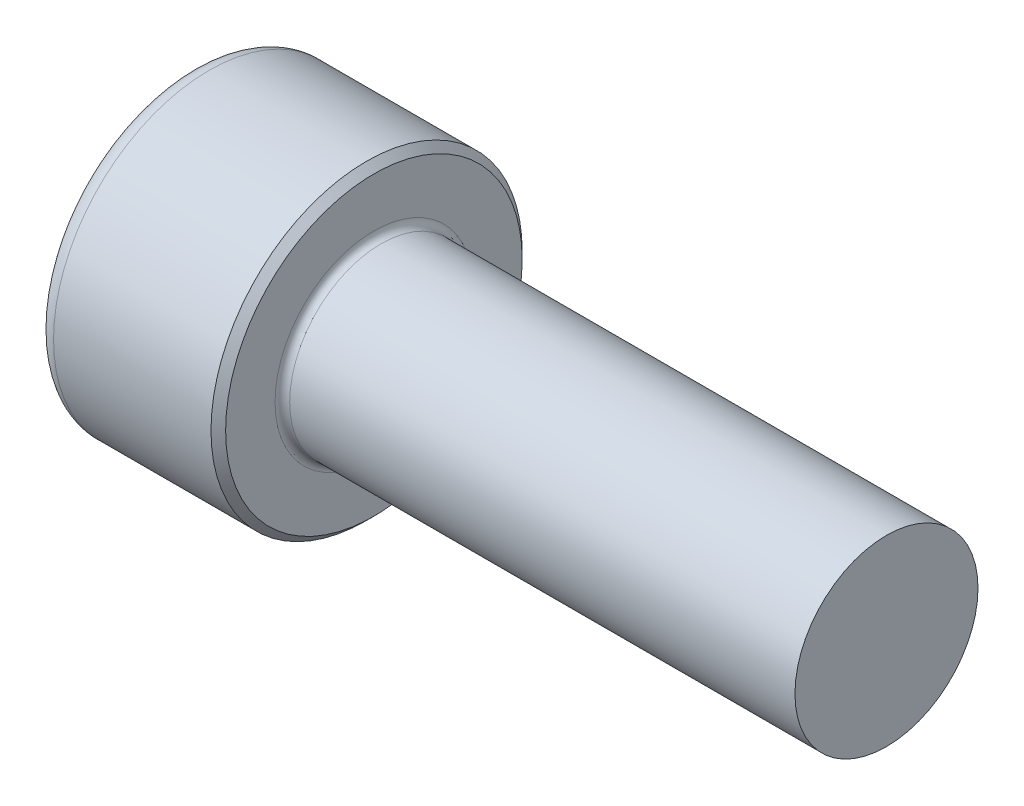
ISO-10303-21;
HEADER;
FILE_DESCRIPTION(('STEP AP214'),'2;1');
FILE_NAME('part.step','',(''),(''),'','','');
FILE_SCHEMA(('AUTOMOTIVE_DESIGN { 1 0 10303 214 1 1 1 1 }'));
ENDSEC;
DATA;
#1=APPLICATION_CONTEXT('core data for automotive mechanical design processes');
#2=APPLICATION_PROTOCOL_DEFINITION('international standard','automotive_design',2000,#1);
#3=PRODUCT_CONTEXT('',#1,'mechanical');
#4=PRODUCT('Part','Part','',(#3));
#5=PRODUCT_RELATED_PRODUCT_CATEGORY('part','',(#4));
#6=PRODUCT_DEFINITION_FORMATION('','',#4);
#7=PRODUCT_DEFINITION_CONTEXT('part definition',#1,'design');
#8=PRODUCT_DEFINITION('design','',#6,#7);
#9=PRODUCT_DEFINITION_SHAPE('','',#8);
#10=(LENGTH_UNIT() NAMED_UNIT(*) SI_UNIT(.MILLI.,.METRE.));
#11=(NAMED_UNIT(*) PLANE_ANGLE_UNIT() SI_UNIT($,.RADIAN.));
#12=(NAMED_UNIT(*) SI_UNIT($,.STERADIAN.) SOLID_ANGLE_UNIT());
#13=UNCERTAINTY_MEASURE_WITH_UNIT(LENGTH_MEASURE(1.E-05),#10,'distance_accuracy_value','');
#14=(GEOMETRIC_REPRESENTATION_CONTEXT(3) GLOBAL_UNCERTAINTY_ASSIGNED_CONTEXT((#13)) GLOBAL_UNIT_ASSIGNED_CONTEXT((#10,
#11,#12)) REPRESENTATION_CONTEXT('',''));
#15=CARTESIAN_POINT('',(0.,0.,0.));
#16=DIRECTION('',(0.,0.,1.));
#17=DIRECTION('',(1.,0.,0.));
#18=AXIS2_PLACEMENT_3D('',#15,#16,#17);
#19=CARTESIAN_POINT('',(0.,0.,0.));
#20=DIRECTION('',(-1.,0.,0.));
#21=DIRECTION('',(0.,0.,1.));
#22=AXIS2_PLACEMENT_3D('',#19,#20,#21);
#23=CYLINDRICAL_SURFACE('',#22,2.5);
#24=CARTESIAN_POINT('',(5.2,0.,0.));
#25=DIRECTION('',(-1.,0.,0.));
#26=DIRECTION('',(0.,0.,1.));
#27=AXIS2_PLACEMENT_3D('',#24,#25,#26);
#28=CIRCLE('',#27,2.5);
#29=CARTESIAN_POINT('',(5.2,0.,2.5));
#30=VERTEX_POINT('',#29);
#31=EDGE_CURVE('E201',#30,#30,#28,.T.);
#32=ORIENTED_EDGE('',*,*,#31,.F.);
#33=EDGE_LOOP('',(#32));
#34=FACE_BOUND('',#33,.T.);
#35=CARTESIAN_POINT('',(19.,0.,0.));
#36=DIRECTION('',(1.,0.,0.));
#37=DIRECTION('',(0.,0.,-1.));
#38=AXIS2_PLACEMENT_3D('',#35,#36,#37);
#39=CIRCLE('',#38,2.5);
#40=CARTESIAN_POINT('',(19.,0.,-2.5));
#41=VERTEX_POINT('',#40);
#42=EDGE_CURVE('E48',#41,#41,#39,.T.);
#43=ORIENTED_EDGE('',*,*,#42,.F.);
#44=EDGE_LOOP('',(#43));
#45=FACE_BOUND('',#44,.T.);
#46=ADVANCED_FACE('F44',(#34,#45),#23,.T.);
#47=CARTESIAN_POINT('',(0.,0.,0.));
#48=DIRECTION('',(1.,0.,0.));
#49=DIRECTION('',(0.,0.,-1.));
#50=AXIS2_PLACEMENT_3D('',#47,#48,#49);
#51=PLANE('',#50);
#52=CARTESIAN_POINT('',(0.,0.,0.));
#53=DIRECTION('',(1.,0.,0.));
#54=DIRECTION('',(0.,0.,-1.));
#55=AXIS2_PLACEMENT_3D('',#52,#53,#54);
#56=CIRCLE('',#55,3.75);
#57=CARTESIAN_POINT('',(0.,0.,-3.75));
#58=VERTEX_POINT('',#57);
#59=EDGE_CURVE('E193',#58,#58,#56,.F.);
#60=ORIENTED_EDGE('',*,*,#59,.T.);
#61=EDGE_LOOP('',(#60));
#62=FACE_BOUND('',#61,.T.);
#63=CARTESIAN_POINT('',(0.,0.,0.));
#64=DIRECTION('',(-1.,0.,0.));
#65=DIRECTION('',(0.,0.,1.));
#66=AXIS2_PLACEMENT_3D('',#63,#64,#65);
#67=CIRCLE('',#66,2.29);
#68=CARTESIAN_POINT('',(0.,0.,-2.29));
#69=VERTEX_POINT('',#68);
#70=CARTESIAN_POINT('',(0.,-1.98319817466637,-1.145));
#71=VERTEX_POINT('',#70);
#72=EDGE_CURVE('E67',#69,#71,#67,.T.);
#73=ORIENTED_EDGE('',*,*,#72,.F.);
#74=CARTESIAN_POINT('',(0.,1.98319817466637,-1.145));
#75=VERTEX_POINT('',#74);
#76=EDGE_CURVE('E146',#75,#69,#67,.T.);
#77=ORIENTED_EDGE('',*,*,#76,.F.);
#78=CARTESIAN_POINT('',(0.,1.98319817466637,1.145));
#79=VERTEX_POINT('',#78);
#80=EDGE_CURVE('E138',#79,#75,#67,.T.);
#81=ORIENTED_EDGE('',*,*,#80,.F.);
#82=CARTESIAN_POINT('',(0.,0.,2.29));
#83=VERTEX_POINT('',#82);
#84=EDGE_CURVE('E109',#83,#79,#67,.T.);
#85=ORIENTED_EDGE('',*,*,#84,.F.);
#86=CARTESIAN_POINT('',(0.,-1.98319817466637,1.145));
#87=VERTEX_POINT('',#86);
#88=EDGE_CURVE('E99',#87,#83,#67,.T.);
#89=ORIENTED_EDGE('',*,*,#88,.F.);
#90=EDGE_CURVE('E60',#71,#87,#67,.T.);
#91=ORIENTED_EDGE('',*,*,#90,.F.);
#92=EDGE_LOOP('',(#73,#77,#81,#85,#89,#91));
#93=FACE_BOUND('',#92,.T.);
#94=ADVANCED_FACE('F136',(#62,#93),#51,.F.);
#95=CARTESIAN_POINT('',(0.,0.,0.));
#96=DIRECTION('',(-1.,0.,0.));
#97=DIRECTION('',(0.,0.,1.));
#98=AXIS2_PLACEMENT_3D('',#95,#96,#97);
#99=CYLINDRICAL_SURFACE('',#98,4.25);
#100=CARTESIAN_POINT('',(4.8,0.,0.));
#101=DIRECTION('',(-1.,0.,0.));
#102=DIRECTION('',(0.,0.,1.));
#103=AXIS2_PLACEMENT_3D('',#100,#101,#102);
#104=CIRCLE('',#103,4.25);
#105=CARTESIAN_POINT('',(4.8,0.,4.25));
#106=VERTEX_POINT('',#105);
#107=EDGE_CURVE('E185',#106,#106,#104,.T.);
#108=ORIENTED_EDGE('',*,*,#107,.T.);
#109=EDGE_LOOP('',(#108));
#110=FACE_BOUND('',#109,.T.);
#111=CARTESIAN_POINT('',(0.5,0.,0.));
#112=DIRECTION('',(1.,0.,0.));
#113=DIRECTION('',(0.,0.,-1.));
#114=AXIS2_PLACEMENT_3D('',#111,#112,#113);
#115=CIRCLE('',#114,4.25);
#116=CARTESIAN_POINT('',(0.5,0.,-4.25));
#117=VERTEX_POINT('',#116);
#118=EDGE_CURVE('E189',#117,#117,#115,.T.);
#119=ORIENTED_EDGE('',*,*,#118,.T.);
#120=EDGE_LOOP('',(#119));
#121=FACE_BOUND('',#120,.T.);
#122=ADVANCED_FACE('F272',(#110,#121),#99,.T.);
#123=CARTESIAN_POINT('',(5.,4.25,0.));
#124=DIRECTION('',(-1.,0.,0.));
#125=DIRECTION('',(0.,0.,1.));
#126=AXIS2_PLACEMENT_3D('',#123,#124,#125);
#127=PLANE('',#126);
#128=CARTESIAN_POINT('',(5.,0.,0.));
#129=DIRECTION('',(-1.,0.,0.));
#130=DIRECTION('',(0.,0.,1.));
#131=AXIS2_PLACEMENT_3D('',#128,#129,#130);
#132=CIRCLE('',#131,4.05);
#133=CARTESIAN_POINT('',(5.,0.,4.05));
#134=VERTEX_POINT('',#133);
#135=EDGE_CURVE('E54',#134,#134,#132,.F.);
#136=ORIENTED_EDGE('',*,*,#135,.T.);
#137=EDGE_LOOP('',(#136));
#138=FACE_BOUND('',#137,.T.);
#139=CARTESIAN_POINT('',(5.,0.,0.));
#140=DIRECTION('',(-1.,0.,0.));
#141=DIRECTION('',(0.,0.,1.));
#142=AXIS2_PLACEMENT_3D('',#139,#140,#141);
#143=CIRCLE('',#142,2.7);
#144=CARTESIAN_POINT('',(5.,0.,2.7));
#145=VERTEX_POINT('',#144);
#146=EDGE_CURVE('E197',#145,#145,#143,.T.);
#147=ORIENTED_EDGE('',*,*,#146,.T.);
#148=EDGE_LOOP('',(#147));
#149=FACE_BOUND('',#148,.T.);
#150=ADVANCED_FACE('F282',(#138,#149),#127,.F.);
#151=CARTESIAN_POINT('',(5.2,0.,0.));
#152=DIRECTION('',(-1.,0.,0.));
#153=DIRECTION('',(0.,0.,1.));
#154=AXIS2_PLACEMENT_3D('',#151,#152,#153);
#155=TOROIDAL_SURFACE('',#154,2.7,0.2);
#156=ORIENTED_EDGE('',*,*,#146,.F.);
#157=EDGE_LOOP('',(#156));
#158=FACE_BOUND('',#157,.T.);
#159=ORIENTED_EDGE('',*,*,#31,.T.);
#160=EDGE_LOOP('',(#159));
#161=FACE_BOUND('',#160,.T.);
#162=ADVANCED_FACE('F278',(#158,#161),#155,.F.);
#163=CARTESIAN_POINT('',(0.5,0.,0.));
#164=DIRECTION('',(1.,0.,0.));
#165=DIRECTION('',(0.,0.,-1.));
#166=AXIS2_PLACEMENT_3D('',#163,#164,#165);
#167=TOROIDAL_SURFACE('',#166,3.75,0.5);
#168=ORIENTED_EDGE('',*,*,#118,.F.);
#169=EDGE_LOOP('',(#168));
#170=FACE_BOUND('',#169,.T.);
#171=ORIENTED_EDGE('',*,*,#59,.F.);
#172=EDGE_LOOP('',(#171));
#173=FACE_BOUND('',#172,.T.);
#174=ADVANCED_FACE('F281',(#170,#173),#167,.T.);
#175=CARTESIAN_POINT('',(4.8,0.,0.));
#176=DIRECTION('',(-1.,0.,0.));
#177=DIRECTION('',(0.,0.,1.));
#178=AXIS2_PLACEMENT_3D('',#175,#176,#177);
#179=CONICAL_SURFACE('',#178,4.25,0.785398163397453);
#180=ORIENTED_EDGE('',*,*,#135,.F.);
#181=EDGE_LOOP('',(#180));
#182=FACE_BOUND('',#181,.T.);
#183=ORIENTED_EDGE('',*,*,#107,.F.);
#184=EDGE_LOOP('',(#183));
#185=FACE_BOUND('',#184,.T.);
#186=ADVANCED_FACE('F46',(#182,#185),#179,.T.);
#187=CARTESIAN_POINT('',(0.,0.,0.));
#188=DIRECTION('',(-1.,0.,0.));
#189=DIRECTION('',(0.,0.,1.));
#190=AXIS2_PLACEMENT_3D('',#187,#188,#189);
#191=CONICAL_SURFACE('',#190,2.29,1.0471975511966);
#192=ORIENTED_EDGE('',*,*,#84,.T.);
#193=CARTESIAN_POINT('',(-6.66717087727477E-05,-0.000199999999999763,2.29011547005384));
#194=CARTESIAN_POINT('',(0.0289970746443421,0.086952924434542,2.23979770567089));
#195=CARTESIAN_POINT('',(0.0554298671491021,0.174858144215212,2.18904560336735));
#196=CARTESIAN_POINT('',(0.101569432018717,0.352190878966828,2.08666250122237));
#197=CARTESIAN_POINT('',(0.121259880415737,0.44162154580974,2.03502968164681));
#198=CARTESIAN_POINT('',(0.151912109098693,0.619374508700817,1.93240396067239));
#199=CARTESIAN_POINT('',(0.163077876213052,0.707669449094417,1.88142685306806));
#200=CARTESIAN_POINT('',(0.17640951895551,0.884674966706633,1.7792326698266));
#201=CARTESIAN_POINT('',(0.178586432176738,0.97338490019511,1.72801596584724));
#202=CARTESIAN_POINT('',(0.174067162231532,1.13915625525884,1.63230782937726));
#203=CARTESIAN_POINT('',(0.168480615987234,1.21624244292292,1.5878020981786));
#204=CARTESIAN_POINT('',(0.150771602252674,1.36991258205614,1.49908060198363));
#205=CARTESIAN_POINT('',(0.138643080409066,1.44649600167483,1.45486514405132));
#206=CARTESIAN_POINT('',(0.108321556973433,1.60048319626379,1.36596059580363));
#207=CARTESIAN_POINT('',(0.0899999732190711,1.67786747328963,1.32128276263171));
#208=CARTESIAN_POINT('',(0.0484167389071468,1.83148159838581,1.2325936061561));
#209=CARTESIAN_POINT('',(0.0251648643389043,1.90771341577406,1.18858114586619));
#210=CARTESIAN_POINT('',(-6.667170877254E-05,1.98339817466637,1.14488452994616));
#211=B_SPLINE_CURVE_WITH_KNOTS('',3,(#193,#194,#195,#196,#197,#198,#199,#200,#201,#202,#203,
#204,#205,#206,#207,#208,#209,#210),.UNSPECIFIED.,.F.,.F.,(4,2,2,2,2,2,2,2,4),(0.,
0.314368600877967,0.629493028947399,0.936817561586036,1.24376461187035,1.5110699369469,
1.7786230686029,2.05211240025128,2.32506443371539),.UNSPECIFIED.);
#212=EDGE_CURVE('E11',#83,#79,#211,.T.);
#213=ORIENTED_EDGE('',*,*,#212,.F.);
#214=EDGE_LOOP('',(#192,#213));
#215=FACE_BOUND('',#214,.T.);
#216=ADVANCED_FACE('F112',(#215),#191,.F.);
#217=ORIENTED_EDGE('',*,*,#80,.T.);
#218=CARTESIAN_POINT('',(-0.737423065904649,1.98319817466636,-2.9651690756887));
#219=CARTESIAN_POINT('',(-0.696335597798475,1.98319817466636,-2.87952774841077));
#220=CARTESIAN_POINT('',(-0.65567489694743,1.98319817466636,-2.79367778718436));
#221=CARTESIAN_POINT('',(-0.575449127727106,1.98319817466636,-2.62144940035753));
#222=CARTESIAN_POINT('',(-0.535884256534338,1.98319817466636,-2.53507088302234));
#223=CARTESIAN_POINT('',(-0.457871214679984,1.98319817466636,-2.36117891825076));
#224=CARTESIAN_POINT('',(-0.419431273823567,1.98319817466636,-2.27366176473997));
#225=CARTESIAN_POINT('',(-0.344275135005474,1.98319817466636,-2.09789307129859));
#226=CARTESIAN_POINT('',(-0.307558847416684,1.98319817466636,-2.00964156983442));
#227=CARTESIAN_POINT('',(-0.23537405891633,1.98319817466636,-1.82993909718885));
#228=CARTESIAN_POINT('',(-0.199963281311202,1.98319817466636,-1.73846480209699));
#229=CARTESIAN_POINT('',(-0.132085804136675,1.98319817466636,-1.55440976387771));
#230=CARTESIAN_POINT('',(-0.0996194460365617,1.98319817466636,-1.46182889382445));
#231=CARTESIAN_POINT('',(-0.0385592553831905,1.98319817466636,-1.27562724000914));
#232=CARTESIAN_POINT('',(-0.00995646709253792,1.98319817466636,-1.18200942505016));
#233=CARTESIAN_POINT('',(0.04239847198178,1.98319817466636,-0.993432151978476));
#234=CARTESIAN_POINT('',(0.0661518274561018,1.98319817466636,-0.898473033353332));
#235=CARTESIAN_POINT('',(0.107541445767531,1.98319817466636,-0.707410736519421));
#236=CARTESIAN_POINT('',(0.12519027230812,1.98319817466636,-0.611310334196718));
#237=CARTESIAN_POINT('',(0.153215985445547,1.98319817466636,-0.418035031067098));
#238=CARTESIAN_POINT('',(0.163593363460354,1.98319817466636,-0.320860203322791));
#239=CARTESIAN_POINT('',(0.176110295556352,1.98319817466636,-0.12713531096718));
#240=CARTESIAN_POINT('',(0.178347061886284,1.98319817466637,-0.0305917109258025));
#241=CARTESIAN_POINT('',(0.174654313491269,1.98319817466637,0.162335586315468));
#242=CARTESIAN_POINT('',(0.168724293109126,1.98319817466637,0.258719273244178));
#243=CARTESIAN_POINT('',(0.144538657394588,1.98319817466637,0.496531836309324));
#244=CARTESIAN_POINT('',(0.121750533293761,1.98319817466637,0.637499920804447));
#245=CARTESIAN_POINT('',(0.0629865996332653,1.98319817466637,0.916694739102691));
#246=CARTESIAN_POINT('',(0.0269948957486464,1.98319817466637,1.05491795638262));
#247=CARTESIAN_POINT('',(-0.0344877429393334,1.98319817466637,1.26164599106909));
#248=CARTESIAN_POINT('',(-0.0565178888246669,1.98319817466637,1.33121940303916));
#249=CARTESIAN_POINT('',(-0.102616094096623,1.98319817466637,1.46964201153911));
#250=CARTESIAN_POINT('',(-0.126682881667825,1.98319817466637,1.53849163028932));
#251=CARTESIAN_POINT('',(-0.176504851106972,1.98319817466637,1.67555866191056));
#252=CARTESIAN_POINT('',(-0.202259726135116,1.98319817466637,1.74377618711701));
#253=CARTESIAN_POINT('',(-0.255179289864796,1.98319817466637,1.87967370656846));
#254=CARTESIAN_POINT('',(-0.282344216759939,1.98319817466637,1.947353607754));
#255=CARTESIAN_POINT('',(-0.353423903033721,1.98319817466637,2.12010925018289));
#256=CARTESIAN_POINT('',(-0.398177319478556,1.98319817466637,2.22483955976595));
#257=CARTESIAN_POINT('',(-0.489841525450775,1.98319817466637,2.43335442741098));
#258=CARTESIAN_POINT('',(-0.536752476595294,1.98319817466637,2.53713891392301));
#259=CARTESIAN_POINT('',(-0.67996107526549,1.98319817466637,2.84738878513368));
#260=CARTESIAN_POINT('',(-0.778719786371109,1.98319817466637,3.05271592662016));
#261=CARTESIAN_POINT('',(-0.980379133367604,1.98319817466637,3.46161603190118));
#262=CARTESIAN_POINT('',(-1.08328471183425,1.98319817466637,3.66518652891241));
#263=CARTESIAN_POINT('',(-1.29174190336883,1.98319817466637,4.07093277316329));
#264=CARTESIAN_POINT('',(-1.39729318010141,1.98319817466637,4.27310869356374));
#265=CARTESIAN_POINT('',(-1.60016980433773,1.98319817466637,4.65745813317928));
#266=CARTESIAN_POINT('',(-1.69733123970717,1.98319817466637,4.83971847371059));
#267=CARTESIAN_POINT('',(-1.89276116585672,1.98319817466637,5.20365287690224));
#268=CARTESIAN_POINT('',(-1.99102969760591,1.98319817466637,5.38532691754387));
#269=CARTESIAN_POINT('',(-2.18814518361219,1.98319817466637,5.74776178237518));
#270=CARTESIAN_POINT('',(-2.2869900308882,1.98319817466637,5.92852375401001));
#271=CARTESIAN_POINT('',(-2.48532306225631,1.98319817466637,6.2896822398489));
#272=CARTESIAN_POINT('',(-2.58481121241045,1.98319817466637,6.47007877268312));
#273=CARTESIAN_POINT('',(-2.68453526318773,1.98319817466637,6.65034401162986));
#274=B_SPLINE_CURVE_WITH_KNOTS('',3,(#218,#219,#220,#221,#222,#223,#224,#225,#226,#227,#228,
#229,#230,#231,#232,#233,#234,#235,#236,#237,#238,#239,#240,#241,#242,#243,#244,#245,#246,#247,
#248,#249,#250,#251,#252,#253,#254,#255,#256,#257,#258,#259,#260,#261,#262,#263,#264,#265,#266,
#267,#268,#269,#270,#271,#272,#273),.UNSPECIFIED.,.F.,.F.,(4,2,2,2,2,2,2,2,2,2,2,2,2,2,2,2,2,2,
2,2,2,2,2,2,2,2,2,4),(0.,0.284966421400571,0.569983789027809,0.856730082121155,1.14346144832977,
1.43768959624628,1.7319518227787,2.02551979602491,2.31901475246749,2.61190202306262,
2.90476949788358,3.19412796273653,3.48350434439975,3.91101968257654,4.33905135689423,
4.55796121431233,4.77673536450837,4.99546985831853,5.21424142296245,5.55588111803492,
5.89754644655145,6.58098995249444,7.26527364177401,7.94947077806411,8.56908938652166,
9.18873100032677,9.80679654089589,10.4248297367012),.UNSPECIFIED.);
#275=EDGE_CURVE('E140',#79,#75,#274,.F.);
#276=ORIENTED_EDGE('',*,*,#275,.F.);
#277=EDGE_LOOP('',(#217,#276));
#278=FACE_BOUND('',#277,.T.);
#279=ADVANCED_FACE('F302',(#278),#191,.F.);
#280=ORIENTED_EDGE('',*,*,#76,.T.);
#281=CARTESIAN_POINT('',(-6.66717087728214E-05,1.98339817466637,-1.14488452994616));
#282=CARTESIAN_POINT('',(0.0289970746443418,1.89624525023182,-1.19520229432911));
#283=CARTESIAN_POINT('',(0.0554298671491018,1.80834003045115,-1.24595439663265));
#284=CARTESIAN_POINT('',(0.101569432018717,1.63100729569954,-1.34833749877763));
#285=CARTESIAN_POINT('',(0.121259880415736,1.54157662885663,-1.39997031835319));
#286=CARTESIAN_POINT('',(0.151912109098692,1.36382366596555,-1.50259603932761));
#287=CARTESIAN_POINT('',(0.163077876213052,1.27552872557195,-1.55357314693194));
#288=CARTESIAN_POINT('',(0.17640951895551,1.09852320795973,-1.6557673301734));
#289=CARTESIAN_POINT('',(0.178586432176738,1.00981327447126,-1.70698403415276));
#290=CARTESIAN_POINT('',(0.174067162231532,0.844041919407522,-1.80269217062274));
#291=CARTESIAN_POINT('',(0.168480615987233,0.766955731743443,-1.8471979018214));
#292=CARTESIAN_POINT('',(0.150771602252674,0.613285592610222,-1.93591939801637));
#293=CARTESIAN_POINT('',(0.138643080409066,0.53670217299153,-1.98013485594868));
#294=CARTESIAN_POINT('',(0.108321556973432,0.382714978402575,-2.06903940419637));
#295=CARTESIAN_POINT('',(0.089999973219071,0.305330701376735,-2.11371723736828));
#296=CARTESIAN_POINT('',(0.0484167389071468,0.151716576280552,-2.20240639384389));
#297=CARTESIAN_POINT('',(0.0251648643389043,0.0754847588923067,-2.24641885413381));
#298=CARTESIAN_POINT('',(-6.66717087722914E-05,-0.000200000000000301,-2.29011547005384));
#299=B_SPLINE_CURVE_WITH_KNOTS('',3,(#281,#282,#283,#284,#285,#286,#287,#288,#289,#290,#291,
#292,#293,#294,#295,#296,#297,#298),.UNSPECIFIED.,.F.,.F.,(4,2,2,2,2,2,2,2,4),(0.,
0.314368600877967,0.629493028947399,0.936817561586036,1.24376461187035,1.5110699369469,
1.7786230686029,2.05211240025128,2.32506443371539),.UNSPECIFIED.);
#300=EDGE_CURVE('E144',#75,#69,#299,.T.);
#301=ORIENTED_EDGE('',*,*,#300,.F.);
#302=EDGE_LOOP('',(#280,#301));
#303=FACE_BOUND('',#302,.T.);
#304=ADVANCED_FACE('F312',(#303),#191,.F.);
#305=ORIENTED_EDGE('',*,*,#72,.T.);
#306=CARTESIAN_POINT('',(-6.66717087727477E-05,0.000199999999999763,-2.29011547005384));
#307=CARTESIAN_POINT('',(0.028997074644342,-0.086952924434542,-2.23979770567089));
#308=CARTESIAN_POINT('',(0.055429867149102,-0.174858144215212,-2.18904560336735));
#309=CARTESIAN_POINT('',(0.101569432018717,-0.352190878966828,-2.08666250122237));
#310=CARTESIAN_POINT('',(0.121259880415737,-0.44162154580974,-2.03502968164681));
#311=CARTESIAN_POINT('',(0.151912109098693,-0.619374508700817,-1.93240396067239));
#312=CARTESIAN_POINT('',(0.163077876213052,-0.707669449094417,-1.88142685306806));
#313=CARTESIAN_POINT('',(0.17640951895551,-0.884674966706633,-1.7792326698266));
#314=CARTESIAN_POINT('',(0.178586432176738,-0.97338490019511,-1.72801596584724));
#315=CARTESIAN_POINT('',(0.174067162231532,-1.13915625525884,-1.63230782937726));
#316=CARTESIAN_POINT('',(0.168480615987233,-1.21624244292292,-1.5878020981786));
#317=CARTESIAN_POINT('',(0.150771602252674,-1.36991258205614,-1.49908060198363));
#318=CARTESIAN_POINT('',(0.138643080409066,-1.44649600167483,-1.45486514405132));
#319=CARTESIAN_POINT('',(0.108321556973432,-1.60048319626379,-1.36596059580363));
#320=CARTESIAN_POINT('',(0.089999973219071,-1.67786747328963,-1.32128276263171));
#321=CARTESIAN_POINT('',(0.0484167389071469,-1.83148159838581,-1.2325936061561));
#322=CARTESIAN_POINT('',(0.0251648643389044,-1.90771341577406,-1.18858114586619));
#323=CARTESIAN_POINT('',(-6.667170877254E-05,-1.98339817466637,-1.14488452994616));
#324=B_SPLINE_CURVE_WITH_KNOTS('',3,(#306,#307,#308,#309,#310,#311,#312,#313,#314,#315,#316,
#317,#318,#319,#320,#321,#322,#323),.UNSPECIFIED.,.F.,.F.,(4,2,2,2,2,2,2,2,4),(0.,
0.314368600877967,0.6294930289474,0.936817561586036,1.24376461187035,1.5110699369469,
1.7786230686029,2.05211240025128,2.32506443371539),.UNSPECIFIED.);
#325=EDGE_CURVE('E249',#69,#71,#324,.T.);
#326=ORIENTED_EDGE('',*,*,#325,.F.);
#327=EDGE_LOOP('',(#305,#326));
#328=FACE_BOUND('',#327,.T.);
#329=ADVANCED_FACE('F321',(#328),#191,.F.);
#330=ORIENTED_EDGE('',*,*,#90,.T.);
#331=CARTESIAN_POINT('',(-0.737423065904648,-1.98319817466636,-2.9651690756887));
#332=CARTESIAN_POINT('',(-0.696335597798474,-1.98319817466636,-2.87952774841077));
#333=CARTESIAN_POINT('',(-0.655674896947429,-1.98319817466636,-2.79367778718436));
#334=CARTESIAN_POINT('',(-0.575449127727106,-1.98319817466636,-2.62144940035753));
#335=CARTESIAN_POINT('',(-0.535884256534338,-1.98319817466636,-2.53507088302234));
#336=CARTESIAN_POINT('',(-0.457871214679984,-1.98319817466636,-2.36117891825076));
#337=CARTESIAN_POINT('',(-0.419431273823567,-1.98319817466636,-2.27366176473997));
#338=CARTESIAN_POINT('',(-0.344275135005473,-1.98319817466636,-2.09789307129859));
#339=CARTESIAN_POINT('',(-0.307558847416684,-1.98319817466636,-2.00964156983442));
#340=CARTESIAN_POINT('',(-0.23537405891633,-1.98319817466636,-1.82993909718885));
#341=CARTESIAN_POINT('',(-0.199963281311201,-1.98319817466636,-1.73846480209699));
#342=CARTESIAN_POINT('',(-0.132085804136675,-1.98319817466636,-1.55440976387771));
#343=CARTESIAN_POINT('',(-0.0996194460365612,-1.98319817466636,-1.46182889382444));
#344=CARTESIAN_POINT('',(-0.0385592553831901,-1.98319817466636,-1.27562724000913));
#345=CARTESIAN_POINT('',(-0.00995646709253759,-1.98319817466636,-1.18200942505016));
#346=CARTESIAN_POINT('',(0.0423984719817802,-1.98319817466636,-0.993432151978475));
#347=CARTESIAN_POINT('',(0.066151827456102,-1.98319817466636,-0.898473033353331));
#348=CARTESIAN_POINT('',(0.107541445767531,-1.98319817466636,-0.70741073651942));
#349=CARTESIAN_POINT('',(0.12519027230812,-1.98319817466636,-0.611310334196718));
#350=CARTESIAN_POINT('',(0.153215985445547,-1.98319817466636,-0.418035031067098));
#351=CARTESIAN_POINT('',(0.163593363460354,-1.98319817466636,-0.32086020332279));
#352=CARTESIAN_POINT('',(0.176110295556352,-1.98319817466636,-0.12713531096718));
#353=CARTESIAN_POINT('',(0.178347061886284,-1.98319817466637,-0.0305917109258023));
#354=CARTESIAN_POINT('',(0.174654313491269,-1.98319817466637,0.162335586315468));
#355=CARTESIAN_POINT('',(0.168724293109126,-1.98319817466637,0.258719273244179));
#356=CARTESIAN_POINT('',(0.144538657394588,-1.98319817466637,0.496531836309325));
#357=CARTESIAN_POINT('',(0.121750533293761,-1.98319817466637,0.637499920804447));
#358=CARTESIAN_POINT('',(0.0629865996332653,-1.98319817466637,0.916694739102692));
#359=CARTESIAN_POINT('',(0.0269948957486466,-1.98319817466637,1.05491795638262));
#360=CARTESIAN_POINT('',(-0.0344877429393334,-1.98319817466637,1.26164599106909));
#361=CARTESIAN_POINT('',(-0.056517888824667,-1.98319817466637,1.33121940303916));
#362=CARTESIAN_POINT('',(-0.102616094096623,-1.98319817466637,1.46964201153911));
#363=CARTESIAN_POINT('',(-0.126682881667825,-1.98319817466637,1.53849163028932));
#364=CARTESIAN_POINT('',(-0.176504851106972,-1.98319817466637,1.67555866191056));
#365=CARTESIAN_POINT('',(-0.202259726135116,-1.98319817466637,1.74377618711701));
#366=CARTESIAN_POINT('',(-0.255179289864796,-1.98319817466637,1.87967370656846));
#367=CARTESIAN_POINT('',(-0.282344216759939,-1.98319817466637,1.947353607754));
#368=CARTESIAN_POINT('',(-0.353423903033721,-1.98319817466637,2.12010925018289));
#369=CARTESIAN_POINT('',(-0.398177319478556,-1.98319817466637,2.22483955976595));
#370=CARTESIAN_POINT('',(-0.489841525450775,-1.98319817466637,2.43335442741098));
#371=CARTESIAN_POINT('',(-0.536752476595294,-1.98319817466637,2.53713891392301));
#372=CARTESIAN_POINT('',(-0.679961075265491,-1.98319817466637,2.84738878513368));
#373=CARTESIAN_POINT('',(-0.77871978637111,-1.98319817466637,3.05271592662016));
#374=CARTESIAN_POINT('',(-0.980379133367606,-1.98319817466637,3.46161603190118));
#375=CARTESIAN_POINT('',(-1.08328471183425,-1.98319817466637,3.66518652891241));
#376=CARTESIAN_POINT('',(-1.29174190336883,-1.98319817466637,4.07093277316329));
#377=CARTESIAN_POINT('',(-1.39729318010141,-1.98319817466637,4.27310869356374));
#378=CARTESIAN_POINT('',(-1.60016980433774,-1.98319817466637,4.65745813317928));
#379=CARTESIAN_POINT('',(-1.69733123970717,-1.98319817466637,4.83971847371059));
#380=CARTESIAN_POINT('',(-1.89276116585672,-1.98319817466637,5.20365287690224));
#381=CARTESIAN_POINT('',(-1.99102969760592,-1.98319817466637,5.38532691754387));
#382=CARTESIAN_POINT('',(-2.18814518361219,-1.98319817466637,5.74776178237518));
#383=CARTESIAN_POINT('',(-2.2869900308882,-1.98319817466637,5.92852375401001));
#384=CARTESIAN_POINT('',(-2.48532306225631,-1.98319817466637,6.2896822398489));
#385=CARTESIAN_POINT('',(-2.58481121241045,-1.98319817466637,6.47007877268312));
#386=CARTESIAN_POINT('',(-2.68453526318773,-1.98319817466637,6.65034401162987));
#387=B_SPLINE_CURVE_WITH_KNOTS('',3,(#331,#332,#333,#334,#335,#336,#337,#338,#339,#340,#341,
#342,#343,#344,#345,#346,#347,#348,#349,#350,#351,#352,#353,#354,#355,#356,#357,#358,#359,#360,
#361,#362,#363,#364,#365,#366,#367,#368,#369,#370,#371,#372,#373,#374,#375,#376,#377,#378,#379,
#380,#381,#382,#383,#384,#385,#386),.UNSPECIFIED.,.F.,.F.,(4,2,2,2,2,2,2,2,2,2,2,2,2,2,2,2,2,2,
2,2,2,2,2,2,2,2,2,4),(0.,0.284966421400572,0.569983789027809,0.856730082121154,1.14346144832977,
1.43768959624628,1.7319518227787,2.0255197960249,2.31901475246749,2.61190202306262,
2.90476949788358,3.19412796273653,3.48350434439975,3.91101968257654,4.33905135689423,
4.55796121431233,4.77673536450837,4.99546985831853,5.21424142296245,5.55588111803492,
5.89754644655145,6.58098995249444,7.26527364177401,7.94947077806411,8.56908938652166,
9.18873100032678,9.8067965408959,10.4248297367012),.UNSPECIFIED.);
#388=EDGE_CURVE('E125',#71,#87,#387,.T.);
#389=ORIENTED_EDGE('',*,*,#388,.F.);
#390=EDGE_LOOP('',(#330,#389));
#391=FACE_BOUND('',#390,.T.);
#392=ADVANCED_FACE('F315',(#391),#191,.F.);
#393=ORIENTED_EDGE('',*,*,#88,.T.);
#394=CARTESIAN_POINT('',(-6.66717087730718E-05,-1.98339817466637,1.14488452994616));
#395=CARTESIAN_POINT('',(0.0289970746443415,-1.89624525023182,1.19520229432911));
#396=CARTESIAN_POINT('',(0.0554298671491014,-1.80834003045115,1.24595439663265));
#397=CARTESIAN_POINT('',(0.101569432018716,-1.63100729569954,1.34833749877763));
#398=CARTESIAN_POINT('',(0.121259880415736,-1.54157662885663,1.39997031835319));
#399=CARTESIAN_POINT('',(0.151912109098692,-1.36382366596555,1.50259603932761));
#400=CARTESIAN_POINT('',(0.163077876213052,-1.27552872557195,1.55357314693194));
#401=CARTESIAN_POINT('',(0.17640951895551,-1.09852320795973,1.6557673301734));
#402=CARTESIAN_POINT('',(0.178586432176738,-1.00981327447126,1.70698403415276));
#403=CARTESIAN_POINT('',(0.174067162231532,-0.844041919407523,1.80269217062274));
#404=CARTESIAN_POINT('',(0.168480615987233,-0.766955731743443,1.8471979018214));
#405=CARTESIAN_POINT('',(0.150771602252674,-0.613285592610222,1.93591939801637));
#406=CARTESIAN_POINT('',(0.138643080409066,-0.53670217299153,1.98013485594868));
#407=CARTESIAN_POINT('',(0.108321556973433,-0.382714978402575,2.06903940419637));
#408=CARTESIAN_POINT('',(0.089999973219071,-0.305330701376735,2.11371723736828));
#409=CARTESIAN_POINT('',(0.0484167389071468,-0.151716576280552,2.20240639384389));
#410=CARTESIAN_POINT('',(0.0251648643389043,-0.0754847588923072,2.24641885413381));
#411=CARTESIAN_POINT('',(-6.66717087722914E-05,0.000200000000000107,2.29011547005384));
#412=B_SPLINE_CURVE_WITH_KNOTS('',3,(#394,#395,#396,#397,#398,#399,#400,#401,#402,#403,#404,
#405,#406,#407,#408,#409,#410,#411),.UNSPECIFIED.,.F.,.F.,(4,2,2,2,2,2,2,2,4),(0.,
0.314368600877967,0.629493028947399,0.936817561586036,1.24376461187035,1.5110699369469,
1.7786230686029,2.05211240025128,2.32506443371539),.UNSPECIFIED.);
#413=EDGE_CURVE('E103',#87,#83,#412,.T.);
#414=ORIENTED_EDGE('',*,*,#413,.F.);
#415=EDGE_LOOP('',(#393,#414));
#416=FACE_BOUND('',#415,.T.);
#417=ADVANCED_FACE('F101',(#416),#191,.F.);
#418=CARTESIAN_POINT('',(2.5,-1.98319817466637,1.145));
#419=DIRECTION('',(1.,0.,0.));
#420=DIRECTION('',(0.,0.,-1.));
#421=AXIS2_PLACEMENT_3D('',#418,#419,#420);
#422=PLANE('',#421);
#423=DIRECTION('',(0.,0.866025403784439,0.5));
#424=VECTOR('',#423,1.);
#425=CARTESIAN_POINT('',(2.5,-1.98319817466637,1.145));
#426=LINE('',#425,#424);
#427=CARTESIAN_POINT('',(2.5,-1.98319817466637,1.145));
#428=VERTEX_POINT('',#427);
#429=CARTESIAN_POINT('',(2.5,0.,2.29));
#430=VERTEX_POINT('',#429);
#431=EDGE_CURVE('E124',#428,#430,#426,.T.);
#432=ORIENTED_EDGE('',*,*,#431,.T.);
#433=DIRECTION('',(0.,0.866025403784439,-0.5));
#434=VECTOR('',#433,1.);
#435=CARTESIAN_POINT('',(2.5,0.,2.29));
#436=LINE('',#435,#434);
#437=CARTESIAN_POINT('',(2.5,1.98319817466637,1.145));
#438=VERTEX_POINT('',#437);
#439=EDGE_CURVE('E129',#430,#438,#436,.T.);
#440=ORIENTED_EDGE('',*,*,#439,.T.);
#441=DIRECTION('',(0.,0.,-1.));
#442=VECTOR('',#441,1.);
#443=CARTESIAN_POINT('',(2.5,1.98319817466637,1.145));
#444=LINE('',#443,#442);
#445=CARTESIAN_POINT('',(2.5,1.98319817466636,-1.145));
#446=VERTEX_POINT('',#445);
#447=EDGE_CURVE('E231',#438,#446,#444,.T.);
#448=ORIENTED_EDGE('',*,*,#447,.T.);
#449=DIRECTION('',(0.,-0.866025403784439,-0.5));
#450=VECTOR('',#449,1.);
#451=CARTESIAN_POINT('',(2.5,1.98319817466636,-1.145));
#452=LINE('',#451,#450);
#453=CARTESIAN_POINT('',(2.5,0.,-2.29));
#454=VERTEX_POINT('',#453);
#455=EDGE_CURVE('E227',#446,#454,#452,.T.);
#456=ORIENTED_EDGE('',*,*,#455,.T.);
#457=DIRECTION('',(0.,-0.866025403784438,0.5));
#458=VECTOR('',#457,1.);
#459=CARTESIAN_POINT('',(2.5,0.,-2.29));
#460=LINE('',#459,#458);
#461=CARTESIAN_POINT('',(2.5,-1.98319817466636,-1.145));
#462=VERTEX_POINT('',#461);
#463=EDGE_CURVE('E223',#454,#462,#460,.T.);
#464=ORIENTED_EDGE('',*,*,#463,.T.);
#465=DIRECTION('',(0.,0.,1.));
#466=VECTOR('',#465,1.);
#467=CARTESIAN_POINT('',(2.5,-1.98319817466636,-1.145));
#468=LINE('',#467,#466);
#469=EDGE_CURVE('E133',#462,#428,#468,.T.);
#470=ORIENTED_EDGE('',*,*,#469,.T.);
#471=EDGE_LOOP('',(#432,#440,#448,#456,#464,#470));
#472=FACE_BOUND('',#471,.T.);
#473=ADVANCED_FACE('F174',(#472),#422,.F.);
#474=CARTESIAN_POINT('',(2.5,0.,2.29));
#475=DIRECTION('',(0.,0.5,0.866025403784438));
#476=DIRECTION('',(0.,-0.866025403784438,0.5));
#477=AXIS2_PLACEMENT_3D('',#474,#475,#476);
#478=PLANE('',#477);
#479=DIRECTION('',(-1.,0.,0.));
#480=VECTOR('',#479,1.);
#481=CARTESIAN_POINT('',(2.5,0.,2.29));
#482=LINE('',#481,#480);
#483=EDGE_CURVE('E120',#430,#83,#482,.T.);
#484=ORIENTED_EDGE('',*,*,#483,.T.);
#485=ORIENTED_EDGE('',*,*,#212,.T.);
#486=DIRECTION('',(-1.,0.,0.));
#487=VECTOR('',#486,1.);
#488=CARTESIAN_POINT('',(2.5,1.98319817466637,1.145));
#489=LINE('',#488,#487);
#490=EDGE_CURVE('E132',#438,#79,#489,.T.);
#491=ORIENTED_EDGE('',*,*,#490,.F.);
#492=ORIENTED_EDGE('',*,*,#439,.F.);
#493=EDGE_LOOP('',(#484,#485,#491,#492));
#494=FACE_BOUND('',#493,.T.);
#495=ADVANCED_FACE('F127',(#494),#478,.F.);
#496=CARTESIAN_POINT('',(2.5,1.98319817466637,1.145));
#497=DIRECTION('',(0.,1.,0.));
#498=DIRECTION('',(0.,0.,1.));
#499=AXIS2_PLACEMENT_3D('',#496,#497,#498);
#500=PLANE('',#499);
#501=ORIENTED_EDGE('',*,*,#490,.T.);
#502=ORIENTED_EDGE('',*,*,#275,.T.);
#503=DIRECTION('',(-1.,0.,0.));
#504=VECTOR('',#503,1.);
#505=CARTESIAN_POINT('',(2.5,1.98319817466636,-1.145));
#506=LINE('',#505,#504);
#507=EDGE_CURVE('E207',#446,#75,#506,.T.);
#508=ORIENTED_EDGE('',*,*,#507,.F.);
#509=ORIENTED_EDGE('',*,*,#447,.F.);
#510=EDGE_LOOP('',(#501,#502,#508,#509));
#511=FACE_BOUND('',#510,.T.);
#512=ADVANCED_FACE('F163',(#511),#500,.F.);
#513=CARTESIAN_POINT('',(2.5,1.98319817466636,-1.145));
#514=DIRECTION('',(0.,0.5,-0.866025403784439));
#515=DIRECTION('',(0.,0.866025403784439,0.5));
#516=AXIS2_PLACEMENT_3D('',#513,#514,#515);
#517=PLANE('',#516);
#518=ORIENTED_EDGE('',*,*,#507,.T.);
#519=ORIENTED_EDGE('',*,*,#300,.T.);
#520=DIRECTION('',(-1.,0.,0.));
#521=VECTOR('',#520,1.);
#522=CARTESIAN_POINT('',(2.5,0.,-2.29));
#523=LINE('',#522,#521);
#524=EDGE_CURVE('E211',#454,#69,#523,.T.);
#525=ORIENTED_EDGE('',*,*,#524,.F.);
#526=ORIENTED_EDGE('',*,*,#455,.F.);
#527=EDGE_LOOP('',(#518,#519,#525,#526));
#528=FACE_BOUND('',#527,.T.);
#529=ADVANCED_FACE('F167',(#528),#517,.F.);
#530=CARTESIAN_POINT('',(2.5,0.,-2.29));
#531=DIRECTION('',(0.,-0.5,-0.866025403784439));
#532=DIRECTION('',(0.,0.866025403784439,-0.5));
#533=AXIS2_PLACEMENT_3D('',#530,#531,#532);
#534=PLANE('',#533);
#535=ORIENTED_EDGE('',*,*,#524,.T.);
#536=ORIENTED_EDGE('',*,*,#325,.T.);
#537=DIRECTION('',(-1.,0.,0.));
#538=VECTOR('',#537,1.);
#539=CARTESIAN_POINT('',(2.5,-1.98319817466636,-1.145));
#540=LINE('',#539,#538);
#541=EDGE_CURVE('E214',#462,#71,#540,.T.);
#542=ORIENTED_EDGE('',*,*,#541,.F.);
#543=ORIENTED_EDGE('',*,*,#463,.F.);
#544=EDGE_LOOP('',(#535,#536,#542,#543));
#545=FACE_BOUND('',#544,.T.);
#546=ADVANCED_FACE('F257',(#545),#534,.F.);
#547=CARTESIAN_POINT('',(2.5,-1.98319817466636,-1.145));
#548=DIRECTION('',(0.,-1.,0.));
#549=DIRECTION('',(0.,0.,-1.));
#550=AXIS2_PLACEMENT_3D('',#547,#548,#549);
#551=PLANE('',#550);
#552=ORIENTED_EDGE('',*,*,#541,.T.);
#553=ORIENTED_EDGE('',*,*,#388,.T.);
#554=DIRECTION('',(-1.,0.,0.));
#555=VECTOR('',#554,1.);
#556=CARTESIAN_POINT('',(2.5,-1.98319817466637,1.145));
#557=LINE('',#556,#555);
#558=EDGE_CURVE('E122',#428,#87,#557,.T.);
#559=ORIENTED_EDGE('',*,*,#558,.F.);
#560=ORIENTED_EDGE('',*,*,#469,.F.);
#561=EDGE_LOOP('',(#552,#553,#559,#560));
#562=FACE_BOUND('',#561,.T.);
#563=ADVANCED_FACE('F254',(#562),#551,.F.);
#564=CARTESIAN_POINT('',(2.5,-1.98319817466637,1.145));
#565=DIRECTION('',(0.,-0.5,0.866025403784439));
#566=DIRECTION('',(0.,-0.866025403784439,-0.5));
#567=AXIS2_PLACEMENT_3D('',#564,#565,#566);
#568=PLANE('',#567);
#569=ORIENTED_EDGE('',*,*,#558,.T.);
#570=ORIENTED_EDGE('',*,*,#413,.T.);
#571=ORIENTED_EDGE('',*,*,#483,.F.);
#572=ORIENTED_EDGE('',*,*,#431,.F.);
#573=EDGE_LOOP('',(#569,#570,#571,#572));
#574=FACE_BOUND('',#573,.T.);
#575=ADVANCED_FACE('F118',(#574),#568,.F.);
#576=CARTESIAN_POINT('',(19.,0.448420114863301,-1.24177877962136));
#577=DIRECTION('',(1.,0.,0.));
#578=DIRECTION('',(0.,0.,-1.));
#579=AXIS2_PLACEMENT_3D('',#576,#577,#578);
#580=PLANE('',#579);
#581=ORIENTED_EDGE('',*,*,#42,.T.);
#582=EDGE_LOOP('',(#581));
#583=FACE_BOUND('',#582,.T.);
#584=ADVANCED_FACE('F341',(#583),#580,.T.);
#585=CLOSED_SHELL('',(#46,#94,#122,#150,#162,#174,#186,#216,#279,#304,#329,#392,#417,#473,#495,
#512,#529,#546,#563,#575,#584));
#586=MANIFOLD_SOLID_BREP('B2',#585);
#587=ADVANCED_BREP_SHAPE_REPRESENTATION('',(#18,#586),#14);
#588=SHAPE_DEFINITION_REPRESENTATION(#9,#587);
ENDSEC;
END-ISO-10303-21;
